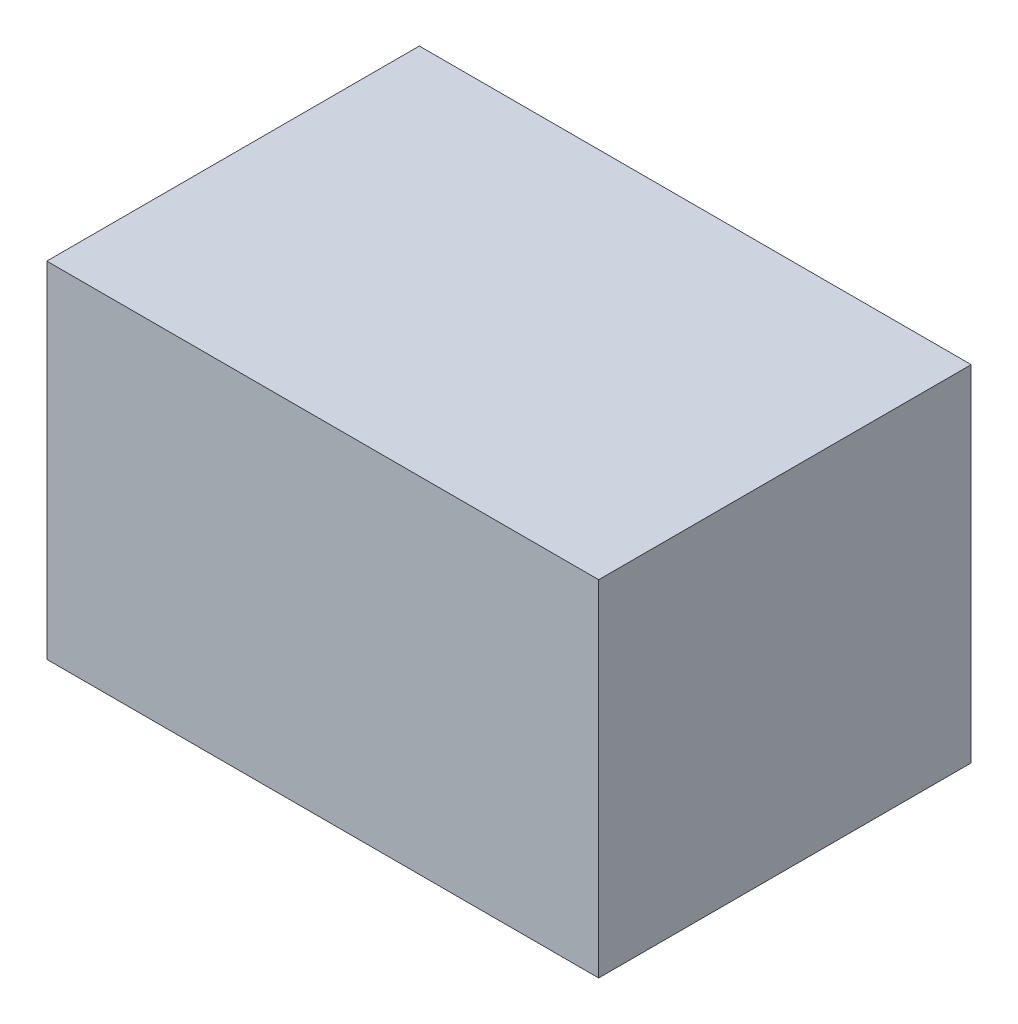
ISO-10303-21;
HEADER;
FILE_DESCRIPTION(('STEP AP214'),'2;1');
FILE_NAME('part.step','',(''),(''),'','','');
FILE_SCHEMA(('AUTOMOTIVE_DESIGN { 1 0 10303 214 1 1 1 1 }'));
ENDSEC;
DATA;
#1=APPLICATION_CONTEXT('core data for automotive mechanical design processes');
#2=APPLICATION_PROTOCOL_DEFINITION('international standard','automotive_design',2000,#1);
#3=PRODUCT_CONTEXT('',#1,'mechanical');
#4=PRODUCT('Part','Part','',(#3));
#5=PRODUCT_RELATED_PRODUCT_CATEGORY('part','',(#4));
#6=PRODUCT_DEFINITION_FORMATION('','',#4);
#7=PRODUCT_DEFINITION_CONTEXT('part definition',#1,'design');
#8=PRODUCT_DEFINITION('design','',#6,#7);
#9=PRODUCT_DEFINITION_SHAPE('','',#8);
#10=(LENGTH_UNIT() NAMED_UNIT(*) SI_UNIT(.MILLI.,.METRE.));
#11=(NAMED_UNIT(*) PLANE_ANGLE_UNIT() SI_UNIT($,.RADIAN.));
#12=(NAMED_UNIT(*) SI_UNIT($,.STERADIAN.) SOLID_ANGLE_UNIT());
#13=UNCERTAINTY_MEASURE_WITH_UNIT(LENGTH_MEASURE(1.E-05),#10,'distance_accuracy_value','');
#14=(GEOMETRIC_REPRESENTATION_CONTEXT(3) GLOBAL_UNCERTAINTY_ASSIGNED_CONTEXT((#13)) GLOBAL_UNIT_ASSIGNED_CONTEXT((#10,
#11,#12)) REPRESENTATION_CONTEXT('',''));
#15=CARTESIAN_POINT('',(0.,0.,0.));
#16=DIRECTION('',(0.,0.,1.));
#17=DIRECTION('',(1.,0.,0.));
#18=AXIS2_PLACEMENT_3D('',#15,#16,#17);
#19=CARTESIAN_POINT('',(1.00000054,0.62500002,0.));
#20=DIRECTION('',(0.,-1.,0.));
#21=DIRECTION('',(0.,0.,-1.));
#22=AXIS2_PLACEMENT_3D('',#19,#20,#21);
#23=PLANE('',#22);
#24=DIRECTION('',(0.,0.,-1.));
#25=VECTOR('',#24,1.);
#26=CARTESIAN_POINT('',(-1.00000054,0.62500002,0.));
#27=LINE('',#26,#25);
#28=CARTESIAN_POINT('',(-1.00000054,0.62500002,0.));
#29=VERTEX_POINT('',#28);
#30=CARTESIAN_POINT('',(-1.00000054,0.62500002,1.35));
#31=VERTEX_POINT('',#30);
#32=EDGE_CURVE('E20',#29,#31,#27,.F.);
#33=ORIENTED_EDGE('',*,*,#32,.T.);
#34=DIRECTION('',(-1.,0.,0.));
#35=VECTOR('',#34,1.);
#36=CARTESIAN_POINT('',(-1.00000054,0.62500002,1.35));
#37=LINE('',#36,#35);
#38=CARTESIAN_POINT('',(1.00000054,0.62500002,1.35));
#39=VERTEX_POINT('',#38);
#40=EDGE_CURVE('E55',#31,#39,#37,.F.);
#41=ORIENTED_EDGE('',*,*,#40,.T.);
#42=DIRECTION('',(0.,0.,1.));
#43=VECTOR('',#42,1.);
#44=CARTESIAN_POINT('',(1.00000054,0.62500002,0.));
#45=LINE('',#44,#43);
#46=CARTESIAN_POINT('',(1.00000054,0.62500002,0.));
#47=VERTEX_POINT('',#46);
#48=EDGE_CURVE('E74',#39,#47,#45,.F.);
#49=ORIENTED_EDGE('',*,*,#48,.T.);
#50=DIRECTION('',(-1.,0.,0.));
#51=VECTOR('',#50,1.);
#52=CARTESIAN_POINT('',(-1.00000054,0.62500002,0.));
#53=LINE('',#52,#51);
#54=EDGE_CURVE('E66',#29,#47,#53,.F.);
#55=ORIENTED_EDGE('',*,*,#54,.F.);
#56=EDGE_LOOP('',(#33,#41,#49,#55));
#57=FACE_BOUND('',#56,.T.);
#58=ADVANCED_FACE('F17',(#57),#23,.F.);
#59=CARTESIAN_POINT('',(-1.00000054,0.62500002,0.));
#60=DIRECTION('',(1.,0.,0.));
#61=DIRECTION('',(0.,0.,-1.));
#62=AXIS2_PLACEMENT_3D('',#59,#60,#61);
#63=PLANE('',#62);
#64=DIRECTION('',(0.,0.,1.));
#65=VECTOR('',#64,1.);
#66=CARTESIAN_POINT('',(-1.00000054,-0.62500002,0.));
#67=LINE('',#66,#65);
#68=CARTESIAN_POINT('',(-1.00000054,-0.62500002,0.));
#69=VERTEX_POINT('',#68);
#70=CARTESIAN_POINT('',(-1.00000054,-0.62500002,1.35));
#71=VERTEX_POINT('',#70);
#72=EDGE_CURVE('E72',#69,#71,#67,.T.);
#73=ORIENTED_EDGE('',*,*,#72,.T.);
#74=DIRECTION('',(0.,1.,0.));
#75=VECTOR('',#74,1.);
#76=CARTESIAN_POINT('',(-1.00000054,0.62500002,1.35));
#77=LINE('',#76,#75);
#78=EDGE_CURVE('E62',#71,#31,#77,.T.);
#79=ORIENTED_EDGE('',*,*,#78,.T.);
#80=ORIENTED_EDGE('',*,*,#32,.F.);
#81=DIRECTION('',(0.,1.,0.));
#82=VECTOR('',#81,1.);
#83=CARTESIAN_POINT('',(-1.00000054,0.62500002,0.));
#84=LINE('',#83,#82);
#85=EDGE_CURVE('E80',#69,#29,#84,.T.);
#86=ORIENTED_EDGE('',*,*,#85,.F.);
#87=EDGE_LOOP('',(#73,#79,#80,#86));
#88=FACE_BOUND('',#87,.T.);
#89=ADVANCED_FACE('F71',(#88),#63,.F.);
#90=CARTESIAN_POINT('',(-1.00000054,0.62500002,1.35));
#91=DIRECTION('',(0.,0.,-1.));
#92=DIRECTION('',(-1.,0.,0.));
#93=AXIS2_PLACEMENT_3D('',#90,#91,#92);
#94=PLANE('',#93);
#95=DIRECTION('',(1.,0.,0.));
#96=VECTOR('',#95,1.);
#97=CARTESIAN_POINT('',(-1.00000054,-0.62500002,1.35));
#98=LINE('',#97,#96);
#99=CARTESIAN_POINT('',(1.00000054,-0.62500002,1.35));
#100=VERTEX_POINT('',#99);
#101=EDGE_CURVE('E83',#71,#100,#98,.T.);
#102=ORIENTED_EDGE('',*,*,#101,.T.);
#103=DIRECTION('',(0.,1.,0.));
#104=VECTOR('',#103,1.);
#105=CARTESIAN_POINT('',(1.00000054,-0.62500002,1.35));
#106=LINE('',#105,#104);
#107=EDGE_CURVE('E64',#100,#39,#106,.T.);
#108=ORIENTED_EDGE('',*,*,#107,.T.);
#109=ORIENTED_EDGE('',*,*,#40,.F.);
#110=ORIENTED_EDGE('',*,*,#78,.F.);
#111=EDGE_LOOP('',(#102,#108,#109,#110));
#112=FACE_BOUND('',#111,.T.);
#113=ADVANCED_FACE('F60',(#112),#94,.F.);
#114=CARTESIAN_POINT('',(1.00000054,-0.62500002,0.));
#115=DIRECTION('',(-1.,0.,0.));
#116=DIRECTION('',(0.,0.,1.));
#117=AXIS2_PLACEMENT_3D('',#114,#115,#116);
#118=PLANE('',#117);
#119=ORIENTED_EDGE('',*,*,#48,.F.);
#120=ORIENTED_EDGE('',*,*,#107,.F.);
#121=DIRECTION('',(0.,0.,1.));
#122=VECTOR('',#121,1.);
#123=CARTESIAN_POINT('',(1.00000054,-0.62500002,0.));
#124=LINE('',#123,#122);
#125=CARTESIAN_POINT('',(1.00000054,-0.62500002,0.));
#126=VERTEX_POINT('',#125);
#127=EDGE_CURVE('E26',#100,#126,#124,.F.);
#128=ORIENTED_EDGE('',*,*,#127,.T.);
#129=DIRECTION('',(0.,1.,0.));
#130=VECTOR('',#129,1.);
#131=CARTESIAN_POINT('',(1.00000054,0.62500002,0.));
#132=LINE('',#131,#130);
#133=EDGE_CURVE('E34',#47,#126,#132,.F.);
#134=ORIENTED_EDGE('',*,*,#133,.F.);
#135=EDGE_LOOP('',(#119,#120,#128,#134));
#136=FACE_BOUND('',#135,.T.);
#137=ADVANCED_FACE('F88',(#136),#118,.F.);
#138=CARTESIAN_POINT('',(-1.00000054,0.62500002,0.));
#139=DIRECTION('',(0.,0.,-1.));
#140=DIRECTION('',(-1.,0.,0.));
#141=AXIS2_PLACEMENT_3D('',#138,#139,#140);
#142=PLANE('',#141);
#143=DIRECTION('',(1.,0.,0.));
#144=VECTOR('',#143,1.);
#145=CARTESIAN_POINT('',(-1.00000054,-0.62500002,0.));
#146=LINE('',#145,#144);
#147=EDGE_CURVE('E11',#126,#69,#146,.F.);
#148=ORIENTED_EDGE('',*,*,#147,.T.);
#149=ORIENTED_EDGE('',*,*,#85,.T.);
#150=ORIENTED_EDGE('',*,*,#54,.T.);
#151=ORIENTED_EDGE('',*,*,#133,.T.);
#152=EDGE_LOOP('',(#148,#149,#150,#151));
#153=FACE_BOUND('',#152,.T.);
#154=ADVANCED_FACE('F91',(#153),#142,.T.);
#155=CARTESIAN_POINT('',(-1.00000054,-0.62500002,0.));
#156=DIRECTION('',(0.,1.,0.));
#157=DIRECTION('',(0.,0.,1.));
#158=AXIS2_PLACEMENT_3D('',#155,#156,#157);
#159=PLANE('',#158);
#160=ORIENTED_EDGE('',*,*,#127,.F.);
#161=ORIENTED_EDGE('',*,*,#101,.F.);
#162=ORIENTED_EDGE('',*,*,#72,.F.);
#163=ORIENTED_EDGE('',*,*,#147,.F.);
#164=EDGE_LOOP('',(#160,#161,#162,#163));
#165=FACE_BOUND('',#164,.T.);
#166=ADVANCED_FACE('F90',(#165),#159,.F.);
#167=CLOSED_SHELL('',(#58,#89,#113,#137,#154,#166));
#168=MANIFOLD_SOLID_BREP('B1',#167);
#169=ADVANCED_BREP_SHAPE_REPRESENTATION('',(#18,#168),#14);
#170=SHAPE_DEFINITION_REPRESENTATION(#9,#169);
ENDSEC;
END-ISO-10303-21;
